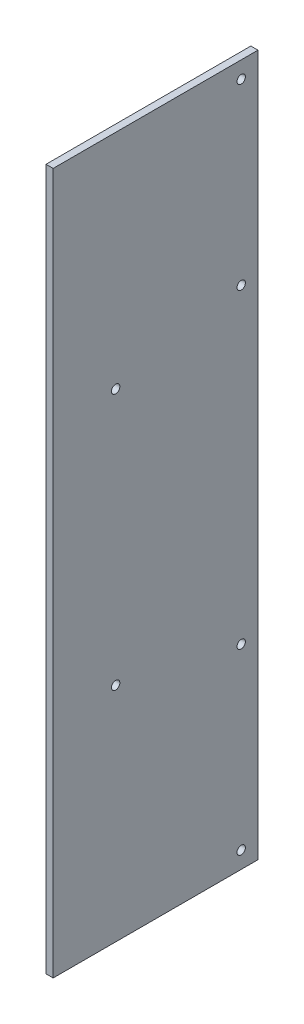
ISO-10303-21;
HEADER;
FILE_DESCRIPTION(('STEP AP214'),'2;1');
FILE_NAME('part.step','',(''),(''),'','','');
FILE_SCHEMA(('AUTOMOTIVE_DESIGN { 1 0 10303 214 1 1 1 1 }'));
ENDSEC;
DATA;
#1=APPLICATION_CONTEXT('core data for automotive mechanical design processes');
#2=APPLICATION_PROTOCOL_DEFINITION('international standard','automotive_design',2000,#1);
#3=PRODUCT_CONTEXT('',#1,'mechanical');
#4=PRODUCT('Part','Part','',(#3));
#5=PRODUCT_RELATED_PRODUCT_CATEGORY('part','',(#4));
#6=PRODUCT_DEFINITION_FORMATION('','',#4);
#7=PRODUCT_DEFINITION_CONTEXT('part definition',#1,'design');
#8=PRODUCT_DEFINITION('design','',#6,#7);
#9=PRODUCT_DEFINITION_SHAPE('','',#8);
#10=(LENGTH_UNIT() NAMED_UNIT(*) SI_UNIT(.MILLI.,.METRE.));
#11=(NAMED_UNIT(*) PLANE_ANGLE_UNIT() SI_UNIT($,.RADIAN.));
#12=(NAMED_UNIT(*) SI_UNIT($,.STERADIAN.) SOLID_ANGLE_UNIT());
#13=UNCERTAINTY_MEASURE_WITH_UNIT(LENGTH_MEASURE(1.E-05),#10,'distance_accuracy_value','');
#14=(GEOMETRIC_REPRESENTATION_CONTEXT(3) GLOBAL_UNCERTAINTY_ASSIGNED_CONTEXT((#13)) GLOBAL_UNIT_ASSIGNED_CONTEXT((#10,
#11,#12)) REPRESENTATION_CONTEXT('',''));
#15=CARTESIAN_POINT('',(0.,0.,0.));
#16=DIRECTION('',(0.,0.,1.));
#17=DIRECTION('',(1.,0.,0.));
#18=AXIS2_PLACEMENT_3D('',#15,#16,#17);
#19=CARTESIAN_POINT('',(5.4102,0.,0.));
#20=DIRECTION('',(0.,1.,0.));
#21=DIRECTION('',(0.,0.,1.));
#22=AXIS2_PLACEMENT_3D('',#19,#20,#21);
#23=PLANE('',#22);
#24=DIRECTION('',(-1.,0.,0.));
#25=VECTOR('',#24,1.);
#26=CARTESIAN_POINT('',(5.4102,0.,0.));
#27=LINE('',#26,#25);
#28=CARTESIAN_POINT('',(5.4102,0.,0.));
#29=VERTEX_POINT('',#28);
#30=CARTESIAN_POINT('',(0.,0.,0.));
#31=VERTEX_POINT('',#30);
#32=EDGE_CURVE('E75',#29,#31,#27,.T.);
#33=ORIENTED_EDGE('',*,*,#32,.F.);
#34=DIRECTION('',(0.,0.,-1.));
#35=VECTOR('',#34,1.);
#36=CARTESIAN_POINT('',(5.4102,0.,0.));
#37=LINE('',#36,#35);
#38=CARTESIAN_POINT('',(5.4102,0.,-154.94));
#39=VERTEX_POINT('',#38);
#40=EDGE_CURVE('E56',#29,#39,#37,.T.);
#41=ORIENTED_EDGE('',*,*,#40,.T.);
#42=DIRECTION('',(-1.,0.,0.));
#43=VECTOR('',#42,1.);
#44=CARTESIAN_POINT('',(5.4102,0.,-154.94));
#45=LINE('',#44,#43);
#46=CARTESIAN_POINT('',(0.,0.,-154.94));
#47=VERTEX_POINT('',#46);
#48=EDGE_CURVE('E11',#39,#47,#45,.T.);
#49=ORIENTED_EDGE('',*,*,#48,.T.);
#50=DIRECTION('',(0.,0.,-1.));
#51=VECTOR('',#50,1.);
#52=CARTESIAN_POINT('',(0.,0.,0.));
#53=LINE('',#52,#51);
#54=EDGE_CURVE('E81',#31,#47,#53,.T.);
#55=ORIENTED_EDGE('',*,*,#54,.F.);
#56=EDGE_LOOP('',(#33,#41,#49,#55));
#57=FACE_BOUND('',#56,.T.);
#58=ADVANCED_FACE('F34',(#57),#23,.T.);
#59=CARTESIAN_POINT('',(5.4102,-147.6502,-142.24));
#60=DIRECTION('',(-1.,0.,0.));
#61=DIRECTION('',(0.,0.,1.));
#62=AXIS2_PLACEMENT_3D('',#59,#60,#61);
#63=CYLINDRICAL_SURFACE('',#62,3.175);
#64=CARTESIAN_POINT('',(5.4102,-147.6502,-142.24));
#65=DIRECTION('',(1.,0.,0.));
#66=DIRECTION('',(0.,0.,-1.));
#67=AXIS2_PLACEMENT_3D('',#64,#65,#66);
#68=CIRCLE('',#67,3.175);
#69=CARTESIAN_POINT('',(5.4102,-147.6502,-145.415));
#70=VERTEX_POINT('',#69);
#71=EDGE_CURVE('E90',#70,#70,#68,.T.);
#72=ORIENTED_EDGE('',*,*,#71,.T.);
#73=EDGE_LOOP('',(#72));
#74=FACE_BOUND('',#73,.T.);
#75=CARTESIAN_POINT('',(0.,-147.6502,-142.24));
#76=DIRECTION('',(1.,0.,0.));
#77=DIRECTION('',(0.,0.,-1.));
#78=AXIS2_PLACEMENT_3D('',#75,#76,#77);
#79=CIRCLE('',#78,3.175);
#80=CARTESIAN_POINT('',(0.,-147.6502,-145.415));
#81=VERTEX_POINT('',#80);
#82=EDGE_CURVE('E93',#81,#81,#79,.T.);
#83=ORIENTED_EDGE('',*,*,#82,.F.);
#84=EDGE_LOOP('',(#83));
#85=FACE_BOUND('',#84,.T.);
#86=ADVANCED_FACE('F112',(#74,#85),#63,.F.);
#87=CARTESIAN_POINT('',(5.4102,0.,-154.94));
#88=DIRECTION('',(0.,0.,-1.));
#89=DIRECTION('',(0.,1.,0.));
#90=AXIS2_PLACEMENT_3D('',#87,#88,#89);
#91=PLANE('',#90);
#92=DIRECTION('',(0.,-1.,0.));
#93=VECTOR('',#92,1.);
#94=CARTESIAN_POINT('',(0.,0.,-154.94));
#95=LINE('',#94,#93);
#96=CARTESIAN_POINT('',(0.,-530.33676,-154.94));
#97=VERTEX_POINT('',#96);
#98=EDGE_CURVE('E103',#47,#97,#95,.T.);
#99=ORIENTED_EDGE('',*,*,#98,.F.);
#100=ORIENTED_EDGE('',*,*,#48,.F.);
#101=DIRECTION('',(0.,-1.,0.));
#102=VECTOR('',#101,1.);
#103=CARTESIAN_POINT('',(5.4102,0.,-154.94));
#104=LINE('',#103,#102);
#105=CARTESIAN_POINT('',(5.4102,-530.33676,-154.94));
#106=VERTEX_POINT('',#105);
#107=EDGE_CURVE('E87',#39,#106,#104,.T.);
#108=ORIENTED_EDGE('',*,*,#107,.T.);
#109=DIRECTION('',(1.,0.,0.));
#110=VECTOR('',#109,1.);
#111=CARTESIAN_POINT('',(-404.416265830774,-530.33676,-154.94));
#112=LINE('',#111,#110);
#113=EDGE_CURVE('E95',#97,#106,#112,.T.);
#114=ORIENTED_EDGE('',*,*,#113,.F.);
#115=EDGE_LOOP('',(#99,#100,#108,#114));
#116=FACE_BOUND('',#115,.T.);
#117=ADVANCED_FACE('F114',(#116),#91,.T.);
#118=CARTESIAN_POINT('',(5.4102,-12.7,-142.24));
#119=DIRECTION('',(-1.,0.,0.));
#120=DIRECTION('',(0.,0.,1.));
#121=AXIS2_PLACEMENT_3D('',#118,#119,#120);
#122=CYLINDRICAL_SURFACE('',#121,3.175);
#123=CARTESIAN_POINT('',(5.4102,-12.7,-142.24));
#124=DIRECTION('',(1.,0.,0.));
#125=DIRECTION('',(0.,0.,-1.));
#126=AXIS2_PLACEMENT_3D('',#123,#124,#125);
#127=CIRCLE('',#126,3.175);
#128=CARTESIAN_POINT('',(5.4102,-12.7,-145.415));
#129=VERTEX_POINT('',#128);
#130=EDGE_CURVE('E41',#129,#129,#127,.T.);
#131=ORIENTED_EDGE('',*,*,#130,.T.);
#132=EDGE_LOOP('',(#131));
#133=FACE_BOUND('',#132,.T.);
#134=CARTESIAN_POINT('',(0.,-12.7,-142.24));
#135=DIRECTION('',(1.,0.,0.));
#136=DIRECTION('',(0.,0.,-1.));
#137=AXIS2_PLACEMENT_3D('',#134,#135,#136);
#138=CIRCLE('',#137,3.175);
#139=CARTESIAN_POINT('',(0.,-12.7,-145.415));
#140=VERTEX_POINT('',#139);
#141=EDGE_CURVE('E88',#140,#140,#138,.T.);
#142=ORIENTED_EDGE('',*,*,#141,.F.);
#143=EDGE_LOOP('',(#142));
#144=FACE_BOUND('',#143,.T.);
#145=ADVANCED_FACE('F121',(#133,#144),#122,.F.);
#146=CARTESIAN_POINT('',(5.4102,0.,0.));
#147=DIRECTION('',(1.,0.,0.));
#148=DIRECTION('',(0.,0.,-1.));
#149=AXIS2_PLACEMENT_3D('',#146,#147,#148);
#150=PLANE('',#149);
#151=CARTESIAN_POINT('',(5.4102,-382.76276,-142.24));
#152=DIRECTION('',(-1.,0.,0.));
#153=DIRECTION('',(0.,0.,1.));
#154=AXIS2_PLACEMENT_3D('',#151,#152,#153);
#155=CIRCLE('',#154,3.175);
#156=CARTESIAN_POINT('',(5.4102,-382.76276,-139.065));
#157=VERTEX_POINT('',#156);
#158=EDGE_CURVE('E159',#157,#157,#155,.T.);
#159=ORIENTED_EDGE('',*,*,#158,.T.);
#160=EDGE_LOOP('',(#159));
#161=FACE_BOUND('',#160,.T.);
#162=CARTESIAN_POINT('',(5.4102,-517.63676,-142.24));
#163=DIRECTION('',(-1.,0.,0.));
#164=DIRECTION('',(0.,0.,1.));
#165=AXIS2_PLACEMENT_3D('',#162,#163,#164);
#166=CIRCLE('',#165,3.175);
#167=CARTESIAN_POINT('',(5.4102,-517.63676,-139.065));
#168=VERTEX_POINT('',#167);
#169=EDGE_CURVE('E167',#168,#168,#166,.T.);
#170=ORIENTED_EDGE('',*,*,#169,.T.);
#171=EDGE_LOOP('',(#170));
#172=FACE_BOUND('',#171,.T.);
#173=DIRECTION('',(0.,-1.,0.));
#174=VECTOR('',#173,1.);
#175=CARTESIAN_POINT('',(5.4102,0.,0.));
#176=LINE('',#175,#174);
#177=CARTESIAN_POINT('',(5.4102,-530.33676,0.));
#178=VERTEX_POINT('',#177);
#179=EDGE_CURVE('E73',#29,#178,#176,.T.);
#180=ORIENTED_EDGE('',*,*,#179,.T.);
#181=DIRECTION('',(0.,0.,-1.));
#182=VECTOR('',#181,1.);
#183=CARTESIAN_POINT('',(5.4102,-530.33676,0.));
#184=LINE('',#183,#182);
#185=EDGE_CURVE('E187',#178,#106,#184,.T.);
#186=ORIENTED_EDGE('',*,*,#185,.T.);
#187=ORIENTED_EDGE('',*,*,#107,.F.);
#188=ORIENTED_EDGE('',*,*,#40,.F.);
#189=EDGE_LOOP('',(#180,#186,#187,#188));
#190=FACE_BOUND('',#189,.T.);
#191=ORIENTED_EDGE('',*,*,#71,.F.);
#192=EDGE_LOOP('',(#191));
#193=FACE_BOUND('',#192,.T.);
#194=ORIENTED_EDGE('',*,*,#130,.F.);
#195=EDGE_LOOP('',(#194));
#196=FACE_BOUND('',#195,.T.);
#197=CARTESIAN_POINT('',(5.4102,-362.18876,-47.2795600000001));
#198=DIRECTION('',(1.,0.,0.));
#199=DIRECTION('',(0.,0.,-1.));
#200=AXIS2_PLACEMENT_3D('',#197,#198,#199);
#201=CIRCLE('',#200,3.175);
#202=CARTESIAN_POINT('',(5.4102,-362.18876,-50.4545600000001));
#203=VERTEX_POINT('',#202);
#204=EDGE_CURVE('E173',#203,#203,#201,.T.);
#205=ORIENTED_EDGE('',*,*,#204,.F.);
#206=EDGE_LOOP('',(#205));
#207=FACE_BOUND('',#206,.T.);
#208=CARTESIAN_POINT('',(5.4102,-168.148,-47.27956));
#209=DIRECTION('',(1.,0.,0.));
#210=DIRECTION('',(0.,0.,-1.));
#211=AXIS2_PLACEMENT_3D('',#208,#209,#210);
#212=CIRCLE('',#211,3.175);
#213=CARTESIAN_POINT('',(5.4102,-168.148,-50.45456));
#214=VERTEX_POINT('',#213);
#215=EDGE_CURVE('E185',#214,#214,#212,.T.);
#216=ORIENTED_EDGE('',*,*,#215,.F.);
#217=EDGE_LOOP('',(#216));
#218=FACE_BOUND('',#217,.T.);
#219=ADVANCED_FACE('F84',(#161,#172,#190,#193,#196,#207,#218),#150,.T.);
#220=CARTESIAN_POINT('',(0.,0.,0.));
#221=DIRECTION('',(1.,0.,0.));
#222=DIRECTION('',(0.,0.,-1.));
#223=AXIS2_PLACEMENT_3D('',#220,#221,#222);
#224=PLANE('',#223);
#225=CARTESIAN_POINT('',(0.,-382.76276,-142.24));
#226=DIRECTION('',(-1.,0.,0.));
#227=DIRECTION('',(0.,0.,1.));
#228=AXIS2_PLACEMENT_3D('',#225,#226,#227);
#229=CIRCLE('',#228,3.175);
#230=CARTESIAN_POINT('',(0.,-382.76276,-139.065));
#231=VERTEX_POINT('',#230);
#232=EDGE_CURVE('E162',#231,#231,#229,.T.);
#233=ORIENTED_EDGE('',*,*,#232,.F.);
#234=EDGE_LOOP('',(#233));
#235=FACE_BOUND('',#234,.T.);
#236=CARTESIAN_POINT('',(0.,-517.63676,-142.24));
#237=DIRECTION('',(-1.,0.,0.));
#238=DIRECTION('',(0.,0.,1.));
#239=AXIS2_PLACEMENT_3D('',#236,#237,#238);
#240=CIRCLE('',#239,3.175);
#241=CARTESIAN_POINT('',(0.,-517.63676,-139.065));
#242=VERTEX_POINT('',#241);
#243=EDGE_CURVE('E164',#242,#242,#240,.T.);
#244=ORIENTED_EDGE('',*,*,#243,.F.);
#245=EDGE_LOOP('',(#244));
#246=FACE_BOUND('',#245,.T.);
#247=DIRECTION('',(0.,0.,1.));
#248=VECTOR('',#247,1.);
#249=CARTESIAN_POINT('',(0.,-530.33676,0.));
#250=LINE('',#249,#248);
#251=CARTESIAN_POINT('',(0.,-530.33676,0.));
#252=VERTEX_POINT('',#251);
#253=EDGE_CURVE('E175',#97,#252,#250,.T.);
#254=ORIENTED_EDGE('',*,*,#253,.T.);
#255=DIRECTION('',(0.,-1.,0.));
#256=VECTOR('',#255,1.);
#257=CARTESIAN_POINT('',(0.,0.,0.));
#258=LINE('',#257,#256);
#259=EDGE_CURVE('E48',#31,#252,#258,.T.);
#260=ORIENTED_EDGE('',*,*,#259,.F.);
#261=ORIENTED_EDGE('',*,*,#54,.T.);
#262=ORIENTED_EDGE('',*,*,#98,.T.);
#263=EDGE_LOOP('',(#254,#260,#261,#262));
#264=FACE_BOUND('',#263,.T.);
#265=ORIENTED_EDGE('',*,*,#82,.T.);
#266=EDGE_LOOP('',(#265));
#267=FACE_BOUND('',#266,.T.);
#268=ORIENTED_EDGE('',*,*,#141,.T.);
#269=EDGE_LOOP('',(#268));
#270=FACE_BOUND('',#269,.T.);
#271=CARTESIAN_POINT('',(0.,-362.18876,-47.2795600000001));
#272=DIRECTION('',(1.,0.,0.));
#273=DIRECTION('',(0.,0.,-1.));
#274=AXIS2_PLACEMENT_3D('',#271,#272,#273);
#275=CIRCLE('',#274,3.175);
#276=CARTESIAN_POINT('',(0.,-362.18876,-50.4545600000001));
#277=VERTEX_POINT('',#276);
#278=EDGE_CURVE('E178',#277,#277,#275,.F.);
#279=ORIENTED_EDGE('',*,*,#278,.F.);
#280=EDGE_LOOP('',(#279));
#281=FACE_BOUND('',#280,.T.);
#282=CARTESIAN_POINT('',(0.,-168.148,-47.27956));
#283=DIRECTION('',(1.,0.,0.));
#284=DIRECTION('',(0.,0.,-1.));
#285=AXIS2_PLACEMENT_3D('',#282,#283,#284);
#286=CIRCLE('',#285,3.175);
#287=CARTESIAN_POINT('',(0.,-168.148,-50.45456));
#288=VERTEX_POINT('',#287);
#289=EDGE_CURVE('E104',#288,#288,#286,.F.);
#290=ORIENTED_EDGE('',*,*,#289,.F.);
#291=EDGE_LOOP('',(#290));
#292=FACE_BOUND('',#291,.T.);
#293=ADVANCED_FACE('F109',(#235,#246,#264,#267,#270,#281,#292),#224,.F.);
#294=CARTESIAN_POINT('',(-404.416265830774,-168.148,-47.27956));
#295=DIRECTION('',(1.,0.,0.));
#296=DIRECTION('',(0.,0.,-1.));
#297=AXIS2_PLACEMENT_3D('',#294,#295,#296);
#298=CYLINDRICAL_SURFACE('',#297,3.175);
#299=ORIENTED_EDGE('',*,*,#289,.T.);
#300=EDGE_LOOP('',(#299));
#301=FACE_BOUND('',#300,.T.);
#302=ORIENTED_EDGE('',*,*,#215,.T.);
#303=EDGE_LOOP('',(#302));
#304=FACE_BOUND('',#303,.T.);
#305=ADVANCED_FACE('F129',(#301,#304),#298,.F.);
#306=CARTESIAN_POINT('',(-404.416265830774,-362.18876,-47.2795600000001));
#307=DIRECTION('',(1.,0.,0.));
#308=DIRECTION('',(0.,0.,-1.));
#309=AXIS2_PLACEMENT_3D('',#306,#307,#308);
#310=CYLINDRICAL_SURFACE('',#309,3.175);
#311=ORIENTED_EDGE('',*,*,#278,.T.);
#312=EDGE_LOOP('',(#311));
#313=FACE_BOUND('',#312,.T.);
#314=ORIENTED_EDGE('',*,*,#204,.T.);
#315=EDGE_LOOP('',(#314));
#316=FACE_BOUND('',#315,.T.);
#317=ADVANCED_FACE('F134',(#313,#316),#310,.F.);
#318=CARTESIAN_POINT('',(-404.416265830774,-530.33676,0.));
#319=DIRECTION('',(0.,-1.,0.));
#320=DIRECTION('',(0.,0.,-1.));
#321=AXIS2_PLACEMENT_3D('',#318,#319,#320);
#322=PLANE('',#321);
#323=DIRECTION('',(-1.,0.,0.));
#324=VECTOR('',#323,1.);
#325=CARTESIAN_POINT('',(5.4102,-530.33676,0.));
#326=LINE('',#325,#324);
#327=EDGE_CURVE('E76',#178,#252,#326,.T.);
#328=ORIENTED_EDGE('',*,*,#327,.T.);
#329=ORIENTED_EDGE('',*,*,#253,.F.);
#330=ORIENTED_EDGE('',*,*,#113,.T.);
#331=ORIENTED_EDGE('',*,*,#185,.F.);
#332=EDGE_LOOP('',(#328,#329,#330,#331));
#333=FACE_BOUND('',#332,.T.);
#334=ADVANCED_FACE('F137',(#333),#322,.T.);
#335=CARTESIAN_POINT('',(5.4102,0.,0.));
#336=DIRECTION('',(0.,0.,-1.));
#337=DIRECTION('',(0.,1.,0.));
#338=AXIS2_PLACEMENT_3D('',#335,#336,#337);
#339=PLANE('',#338);
#340=ORIENTED_EDGE('',*,*,#259,.T.);
#341=ORIENTED_EDGE('',*,*,#327,.F.);
#342=ORIENTED_EDGE('',*,*,#179,.F.);
#343=ORIENTED_EDGE('',*,*,#32,.T.);
#344=EDGE_LOOP('',(#340,#341,#342,#343));
#345=FACE_BOUND('',#344,.T.);
#346=ADVANCED_FACE('F74',(#345),#339,.F.);
#347=CARTESIAN_POINT('',(5.4102,-517.63676,-142.24));
#348=DIRECTION('',(-1.,0.,0.));
#349=DIRECTION('',(0.,0.,1.));
#350=AXIS2_PLACEMENT_3D('',#347,#348,#349);
#351=CYLINDRICAL_SURFACE('',#350,3.175);
#352=ORIENTED_EDGE('',*,*,#169,.F.);
#353=EDGE_LOOP('',(#352));
#354=FACE_BOUND('',#353,.T.);
#355=ORIENTED_EDGE('',*,*,#243,.T.);
#356=EDGE_LOOP('',(#355));
#357=FACE_BOUND('',#356,.T.);
#358=ADVANCED_FACE('F147',(#354,#357),#351,.F.);
#359=CARTESIAN_POINT('',(5.4102,-382.76276,-142.24));
#360=DIRECTION('',(-1.,0.,0.));
#361=DIRECTION('',(0.,0.,1.));
#362=AXIS2_PLACEMENT_3D('',#359,#360,#361);
#363=CYLINDRICAL_SURFACE('',#362,3.175);
#364=ORIENTED_EDGE('',*,*,#158,.F.);
#365=EDGE_LOOP('',(#364));
#366=FACE_BOUND('',#365,.T.);
#367=ORIENTED_EDGE('',*,*,#232,.T.);
#368=EDGE_LOOP('',(#367));
#369=FACE_BOUND('',#368,.T.);
#370=ADVANCED_FACE('F150',(#366,#369),#363,.F.);
#371=CLOSED_SHELL('',(#58,#86,#117,#145,#219,#293,#305,#317,#334,#346,#358,#370));
#372=MANIFOLD_SOLID_BREP('B2',#371);
#373=ADVANCED_BREP_SHAPE_REPRESENTATION('',(#18,#372),#14);
#374=SHAPE_DEFINITION_REPRESENTATION(#9,#373);
ENDSEC;
END-ISO-10303-21;
